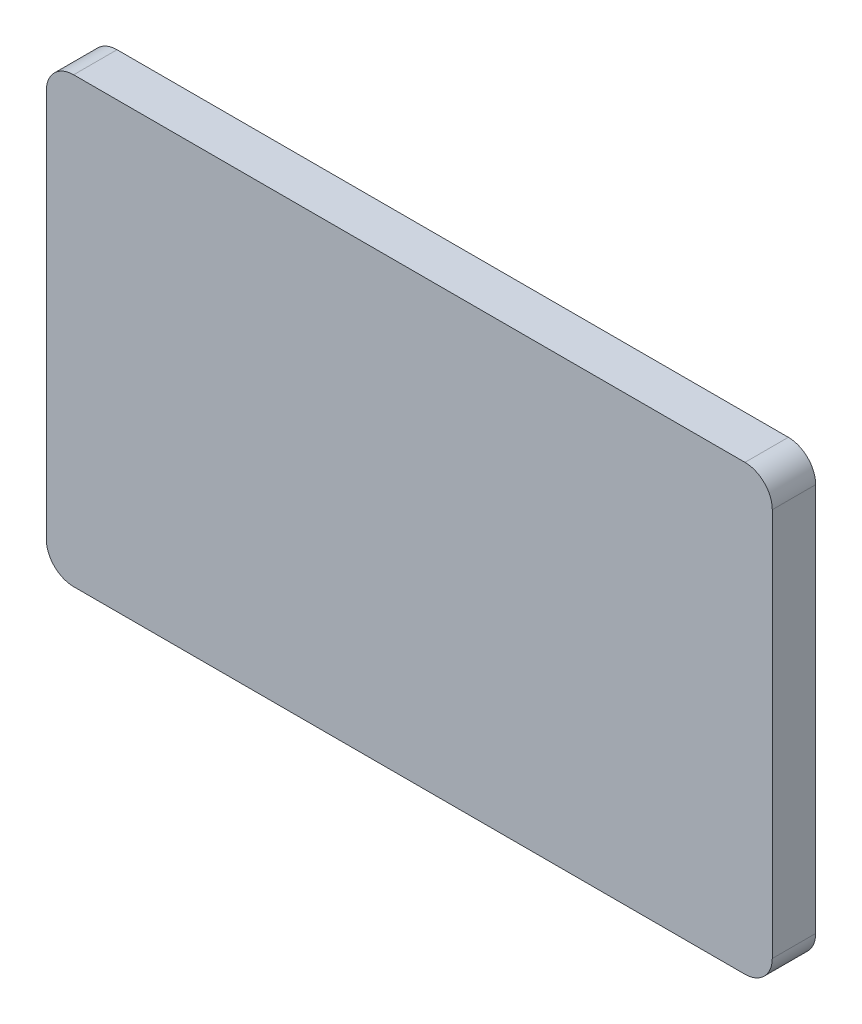
ISO-10303-21;
HEADER;
FILE_DESCRIPTION(('STEP AP214'),'2;1');
FILE_NAME('part.step','',(''),(''),'','','');
FILE_SCHEMA(('AUTOMOTIVE_DESIGN { 1 0 10303 214 1 1 1 1 }'));
ENDSEC;
DATA;
#1=APPLICATION_CONTEXT('core data for automotive mechanical design processes');
#2=APPLICATION_PROTOCOL_DEFINITION('international standard','automotive_design',2000,#1);
#3=PRODUCT_CONTEXT('',#1,'mechanical');
#4=PRODUCT('Part','Part','',(#3));
#5=PRODUCT_RELATED_PRODUCT_CATEGORY('part','',(#4));
#6=PRODUCT_DEFINITION_FORMATION('','',#4);
#7=PRODUCT_DEFINITION_CONTEXT('part definition',#1,'design');
#8=PRODUCT_DEFINITION('design','',#6,#7);
#9=PRODUCT_DEFINITION_SHAPE('','',#8);
#10=(LENGTH_UNIT() NAMED_UNIT(*) SI_UNIT(.MILLI.,.METRE.));
#11=(NAMED_UNIT(*) PLANE_ANGLE_UNIT() SI_UNIT($,.RADIAN.));
#12=(NAMED_UNIT(*) SI_UNIT($,.STERADIAN.) SOLID_ANGLE_UNIT());
#13=UNCERTAINTY_MEASURE_WITH_UNIT(LENGTH_MEASURE(1.E-05),#10,'distance_accuracy_value','');
#14=(GEOMETRIC_REPRESENTATION_CONTEXT(3) GLOBAL_UNCERTAINTY_ASSIGNED_CONTEXT((#13)) GLOBAL_UNIT_ASSIGNED_CONTEXT((#10,
#11,#12)) REPRESENTATION_CONTEXT('',''));
#15=CARTESIAN_POINT('',(0.,0.,0.));
#16=DIRECTION('',(0.,0.,1.));
#17=DIRECTION('',(1.,0.,0.));
#18=AXIS2_PLACEMENT_3D('',#15,#16,#17);
#19=CARTESIAN_POINT('',(-28.1252944361644,50.6768981357298,8.22249975562021));
#20=DIRECTION('',(0.,0.,-1.));
#21=DIRECTION('',(-1.,0.,0.));
#22=AXIS2_PLACEMENT_3D('',#19,#20,#21);
#23=CYLINDRICAL_SURFACE('',#22,1.);
#24=CARTESIAN_POINT('',(-28.1252944361644,50.6768981357298,6.63499975562021));
#25=DIRECTION('',(0.,0.,1.));
#26=DIRECTION('',(1.,0.,0.));
#27=AXIS2_PLACEMENT_3D('',#24,#25,#26);
#28=CIRCLE('',#27,1.);
#29=CARTESIAN_POINT('',(-28.1252944361644,51.6768981357298,6.63499975562021));
#30=VERTEX_POINT('',#29);
#31=CARTESIAN_POINT('',(-29.1252944361645,50.6768981357298,6.63499975562021));
#32=VERTEX_POINT('',#31);
#33=EDGE_CURVE('E256',#30,#32,#28,.T.);
#34=ORIENTED_EDGE('',*,*,#33,.T.);
#35=DIRECTION('',(0.,0.,-1.));
#36=VECTOR('',#35,1.);
#37=CARTESIAN_POINT('',(-29.1252944361645,50.6768981357298,8.22249975562021));
#38=LINE('',#37,#36);
#39=CARTESIAN_POINT('',(-29.1252944361645,50.6768981357298,8.22249975562021));
#40=VERTEX_POINT('',#39);
#41=EDGE_CURVE('E12',#40,#32,#38,.T.);
#42=ORIENTED_EDGE('',*,*,#41,.F.);
#43=CARTESIAN_POINT('',(-28.1252944361644,50.6768981357298,8.22249975562021));
#44=DIRECTION('',(0.,0.,1.));
#45=DIRECTION('',(1.,0.,0.));
#46=AXIS2_PLACEMENT_3D('',#43,#44,#45);
#47=CIRCLE('',#46,1.);
#48=CARTESIAN_POINT('',(-28.1252944361644,51.6768981357298,8.22249975562021));
#49=VERTEX_POINT('',#48);
#50=EDGE_CURVE('E182',#49,#40,#47,.T.);
#51=ORIENTED_EDGE('',*,*,#50,.F.);
#52=DIRECTION('',(0.,0.,-1.));
#53=VECTOR('',#52,1.);
#54=CARTESIAN_POINT('',(-28.1252944361644,51.6768981357298,8.22249975562021));
#55=LINE('',#54,#53);
#56=EDGE_CURVE('E158',#49,#30,#55,.T.);
#57=ORIENTED_EDGE('',*,*,#56,.T.);
#58=EDGE_LOOP('',(#34,#42,#51,#57));
#59=FACE_BOUND('',#58,.T.);
#60=ADVANCED_FACE('F43',(#59),#23,.T.);
#61=CARTESIAN_POINT('',(-29.1252944361645,50.6768981357298,8.22249975562021));
#62=DIRECTION('',(1.,0.,0.));
#63=DIRECTION('',(0.,0.,-1.));
#64=AXIS2_PLACEMENT_3D('',#61,#62,#63);
#65=PLANE('',#64);
#66=DIRECTION('',(0.,-1.,0.));
#67=VECTOR('',#66,1.);
#68=CARTESIAN_POINT('',(-29.1252944361645,50.6768981357298,6.63499975562021));
#69=LINE('',#68,#67);
#70=CARTESIAN_POINT('',(-29.1252944361645,36.4568981357358,6.63499975562021));
#71=VERTEX_POINT('',#70);
#72=EDGE_CURVE('E226',#32,#71,#69,.T.);
#73=ORIENTED_EDGE('',*,*,#72,.T.);
#74=DIRECTION('',(0.,0.,-1.));
#75=VECTOR('',#74,1.);
#76=CARTESIAN_POINT('',(-29.1252944361645,36.4568981357358,8.22249975562021));
#77=LINE('',#76,#75);
#78=CARTESIAN_POINT('',(-29.1252944361645,36.4568981357358,8.22249975562021));
#79=VERTEX_POINT('',#78);
#80=EDGE_CURVE('E54',#79,#71,#77,.T.);
#81=ORIENTED_EDGE('',*,*,#80,.F.);
#82=DIRECTION('',(0.,-1.,0.));
#83=VECTOR('',#82,1.);
#84=CARTESIAN_POINT('',(-29.1252944361645,50.6768981357298,8.22249975562021));
#85=LINE('',#84,#83);
#86=EDGE_CURVE('E117',#40,#79,#85,.T.);
#87=ORIENTED_EDGE('',*,*,#86,.F.);
#88=ORIENTED_EDGE('',*,*,#41,.T.);
#89=EDGE_LOOP('',(#73,#81,#87,#88));
#90=FACE_BOUND('',#89,.T.);
#91=ADVANCED_FACE('F269',(#90),#65,.F.);
#92=CARTESIAN_POINT('',(-28.1252944361644,36.4568981357358,8.22249975562021));
#93=DIRECTION('',(0.,0.,-1.));
#94=DIRECTION('',(-1.,0.,0.));
#95=AXIS2_PLACEMENT_3D('',#92,#93,#94);
#96=CYLINDRICAL_SURFACE('',#95,1.);
#97=CARTESIAN_POINT('',(-28.1252944361644,36.4568981357358,6.63499975562021));
#98=DIRECTION('',(0.,0.,1.));
#99=DIRECTION('',(1.,0.,0.));
#100=AXIS2_PLACEMENT_3D('',#97,#98,#99);
#101=CIRCLE('',#100,1.);
#102=CARTESIAN_POINT('',(-28.1252944361644,35.4568981357358,6.63499975562021));
#103=VERTEX_POINT('',#102);
#104=EDGE_CURVE('E220',#71,#103,#101,.T.);
#105=ORIENTED_EDGE('',*,*,#104,.T.);
#106=DIRECTION('',(0.,0.,-1.));
#107=VECTOR('',#106,1.);
#108=CARTESIAN_POINT('',(-28.1252944361644,35.4568981357358,8.22249975562021));
#109=LINE('',#108,#107);
#110=CARTESIAN_POINT('',(-28.1252944361644,35.4568981357358,8.22249975562021));
#111=VERTEX_POINT('',#110);
#112=EDGE_CURVE('E237',#111,#103,#109,.T.);
#113=ORIENTED_EDGE('',*,*,#112,.F.);
#114=CARTESIAN_POINT('',(-28.1252944361644,36.4568981357358,8.22249975562021));
#115=DIRECTION('',(0.,0.,1.));
#116=DIRECTION('',(1.,0.,0.));
#117=AXIS2_PLACEMENT_3D('',#114,#115,#116);
#118=CIRCLE('',#117,1.);
#119=EDGE_CURVE('E197',#79,#111,#118,.T.);
#120=ORIENTED_EDGE('',*,*,#119,.F.);
#121=ORIENTED_EDGE('',*,*,#80,.T.);
#122=EDGE_LOOP('',(#105,#113,#120,#121));
#123=FACE_BOUND('',#122,.T.);
#124=ADVANCED_FACE('F274',(#123),#96,.T.);
#125=CARTESIAN_POINT('',(-28.1252944361644,35.4568981357358,8.22249975562021));
#126=DIRECTION('',(0.,1.,0.));
#127=DIRECTION('',(0.,0.,1.));
#128=AXIS2_PLACEMENT_3D('',#125,#126,#127);
#129=PLANE('',#128);
#130=DIRECTION('',(1.,0.,0.));
#131=VECTOR('',#130,1.);
#132=CARTESIAN_POINT('',(-28.1252944361644,35.4568981357358,6.63499975562021));
#133=LINE('',#132,#131);
#134=CARTESIAN_POINT('',(-3.56529443617046,35.4568981357358,6.63499975562021));
#135=VERTEX_POINT('',#134);
#136=EDGE_CURVE('E225',#103,#135,#133,.T.);
#137=ORIENTED_EDGE('',*,*,#136,.T.);
#138=DIRECTION('',(0.,0.,-1.));
#139=VECTOR('',#138,1.);
#140=CARTESIAN_POINT('',(-3.56529443617046,35.4568981357358,8.22249975562021));
#141=LINE('',#140,#139);
#142=CARTESIAN_POINT('',(-3.56529443617046,35.4568981357358,8.22249975562021));
#143=VERTEX_POINT('',#142);
#144=EDGE_CURVE('E245',#143,#135,#141,.T.);
#145=ORIENTED_EDGE('',*,*,#144,.F.);
#146=DIRECTION('',(1.,0.,0.));
#147=VECTOR('',#146,1.);
#148=CARTESIAN_POINT('',(-28.1252944361644,35.4568981357358,8.22249975562021));
#149=LINE('',#148,#147);
#150=EDGE_CURVE('E401',#111,#143,#149,.T.);
#151=ORIENTED_EDGE('',*,*,#150,.F.);
#152=ORIENTED_EDGE('',*,*,#112,.T.);
#153=EDGE_LOOP('',(#137,#145,#151,#152));
#154=FACE_BOUND('',#153,.T.);
#155=ADVANCED_FACE('F304',(#154),#129,.F.);
#156=CARTESIAN_POINT('',(-3.56529443617045,36.4568981357358,8.22249975562021));
#157=DIRECTION('',(0.,0.,-1.));
#158=DIRECTION('',(-1.,0.,0.));
#159=AXIS2_PLACEMENT_3D('',#156,#157,#158);
#160=CYLINDRICAL_SURFACE('',#159,1.);
#161=CARTESIAN_POINT('',(-3.56529443617045,36.4568981357358,6.63499975562021));
#162=DIRECTION('',(0.,0.,1.));
#163=DIRECTION('',(1.,0.,0.));
#164=AXIS2_PLACEMENT_3D('',#161,#162,#163);
#165=CIRCLE('',#164,1.);
#166=CARTESIAN_POINT('',(-2.56529443617045,36.4568981357358,6.63499975562021));
#167=VERTEX_POINT('',#166);
#168=EDGE_CURVE('E280',#135,#167,#165,.T.);
#169=ORIENTED_EDGE('',*,*,#168,.T.);
#170=DIRECTION('',(0.,0.,-1.));
#171=VECTOR('',#170,1.);
#172=CARTESIAN_POINT('',(-2.56529443617045,36.4568981357358,8.22249975562021));
#173=LINE('',#172,#171);
#174=CARTESIAN_POINT('',(-2.56529443617045,36.4568981357358,8.22249975562021));
#175=VERTEX_POINT('',#174);
#176=EDGE_CURVE('E151',#175,#167,#173,.T.);
#177=ORIENTED_EDGE('',*,*,#176,.F.);
#178=CARTESIAN_POINT('',(-3.56529443617045,36.4568981357358,8.22249975562021));
#179=DIRECTION('',(0.,0.,1.));
#180=DIRECTION('',(1.,0.,0.));
#181=AXIS2_PLACEMENT_3D('',#178,#179,#180);
#182=CIRCLE('',#181,1.);
#183=EDGE_CURVE('E140',#143,#175,#182,.T.);
#184=ORIENTED_EDGE('',*,*,#183,.F.);
#185=ORIENTED_EDGE('',*,*,#144,.T.);
#186=EDGE_LOOP('',(#169,#177,#184,#185));
#187=FACE_BOUND('',#186,.T.);
#188=ADVANCED_FACE('F314',(#187),#160,.T.);
#189=CARTESIAN_POINT('',(-2.56529443617045,36.4568981357358,8.22249975562021));
#190=DIRECTION('',(-1.,0.,0.));
#191=DIRECTION('',(0.,0.,1.));
#192=AXIS2_PLACEMENT_3D('',#189,#190,#191);
#193=PLANE('',#192);
#194=DIRECTION('',(0.,1.,0.));
#195=VECTOR('',#194,1.);
#196=CARTESIAN_POINT('',(-2.56529443617045,36.4568981357358,6.63499975562021));
#197=LINE('',#196,#195);
#198=CARTESIAN_POINT('',(-2.56529443617045,50.6768981357298,6.63499975562021));
#199=VERTEX_POINT('',#198);
#200=EDGE_CURVE('E149',#167,#199,#197,.T.);
#201=ORIENTED_EDGE('',*,*,#200,.T.);
#202=DIRECTION('',(0.,0.,-1.));
#203=VECTOR('',#202,1.);
#204=CARTESIAN_POINT('',(-2.56529443617045,50.6768981357298,8.22249975562021));
#205=LINE('',#204,#203);
#206=CARTESIAN_POINT('',(-2.56529443617045,50.6768981357298,8.22249975562021));
#207=VERTEX_POINT('',#206);
#208=EDGE_CURVE('E146',#207,#199,#205,.T.);
#209=ORIENTED_EDGE('',*,*,#208,.F.);
#210=DIRECTION('',(0.,1.,0.));
#211=VECTOR('',#210,1.);
#212=CARTESIAN_POINT('',(-2.56529443617045,36.4568981357358,8.22249975562021));
#213=LINE('',#212,#211);
#214=EDGE_CURVE('E134',#175,#207,#213,.T.);
#215=ORIENTED_EDGE('',*,*,#214,.F.);
#216=ORIENTED_EDGE('',*,*,#176,.T.);
#217=EDGE_LOOP('',(#201,#209,#215,#216));
#218=FACE_BOUND('',#217,.T.);
#219=ADVANCED_FACE('F147',(#218),#193,.F.);
#220=CARTESIAN_POINT('',(-3.56529443617045,50.6768981357298,8.22249975562021));
#221=DIRECTION('',(0.,0.,-1.));
#222=DIRECTION('',(-1.,0.,0.));
#223=AXIS2_PLACEMENT_3D('',#220,#221,#222);
#224=CYLINDRICAL_SURFACE('',#223,1.);
#225=CARTESIAN_POINT('',(-3.56529443617045,50.6768981357298,6.63499975562021));
#226=DIRECTION('',(0.,0.,1.));
#227=DIRECTION('',(-1.,0.,0.));
#228=AXIS2_PLACEMENT_3D('',#225,#226,#227);
#229=CIRCLE('',#228,1.);
#230=CARTESIAN_POINT('',(-3.56529443617046,51.6768981357298,6.63499975562021));
#231=VERTEX_POINT('',#230);
#232=EDGE_CURVE('E101',#199,#231,#229,.T.);
#233=ORIENTED_EDGE('',*,*,#232,.T.);
#234=DIRECTION('',(0.,0.,-1.));
#235=VECTOR('',#234,1.);
#236=CARTESIAN_POINT('',(-3.56529443617046,51.6768981357298,8.22249975562021));
#237=LINE('',#236,#235);
#238=CARTESIAN_POINT('',(-3.56529443617046,51.6768981357298,8.22249975562021));
#239=VERTEX_POINT('',#238);
#240=EDGE_CURVE('E152',#239,#231,#237,.T.);
#241=ORIENTED_EDGE('',*,*,#240,.F.);
#242=CARTESIAN_POINT('',(-3.56529443617045,50.6768981357298,8.22249975562021));
#243=DIRECTION('',(0.,0.,1.));
#244=DIRECTION('',(-1.,0.,0.));
#245=AXIS2_PLACEMENT_3D('',#242,#243,#244);
#246=CIRCLE('',#245,1.);
#247=EDGE_CURVE('E138',#207,#239,#246,.T.);
#248=ORIENTED_EDGE('',*,*,#247,.F.);
#249=ORIENTED_EDGE('',*,*,#208,.T.);
#250=EDGE_LOOP('',(#233,#241,#248,#249));
#251=FACE_BOUND('',#250,.T.);
#252=ADVANCED_FACE('F154',(#251),#224,.T.);
#253=CARTESIAN_POINT('',(-3.56529443617046,51.6768981357298,8.22249975562021));
#254=DIRECTION('',(0.,-1.,0.));
#255=DIRECTION('',(0.,0.,-1.));
#256=AXIS2_PLACEMENT_3D('',#253,#254,#255);
#257=PLANE('',#256);
#258=DIRECTION('',(-1.,0.,0.));
#259=VECTOR('',#258,1.);
#260=CARTESIAN_POINT('',(-3.56529443617046,51.6768981357298,6.63499975562021));
#261=LINE('',#260,#259);
#262=EDGE_CURVE('E109',#231,#30,#261,.T.);
#263=ORIENTED_EDGE('',*,*,#262,.T.);
#264=ORIENTED_EDGE('',*,*,#56,.F.);
#265=DIRECTION('',(-1.,0.,0.));
#266=VECTOR('',#265,1.);
#267=CARTESIAN_POINT('',(-3.56529443617046,51.6768981357298,8.22249975562021));
#268=LINE('',#267,#266);
#269=EDGE_CURVE('E65',#239,#49,#268,.T.);
#270=ORIENTED_EDGE('',*,*,#269,.F.);
#271=ORIENTED_EDGE('',*,*,#240,.T.);
#272=EDGE_LOOP('',(#263,#264,#270,#271));
#273=FACE_BOUND('',#272,.T.);
#274=ADVANCED_FACE('F324',(#273),#257,.F.);
#275=CARTESIAN_POINT('',(-28.1252944361644,50.6768981357298,8.22249975562021));
#276=DIRECTION('',(0.,0.,1.));
#277=DIRECTION('',(1.,0.,0.));
#278=AXIS2_PLACEMENT_3D('',#275,#276,#277);
#279=PLANE('',#278);
#280=ORIENTED_EDGE('',*,*,#50,.T.);
#281=ORIENTED_EDGE('',*,*,#86,.T.);
#282=ORIENTED_EDGE('',*,*,#119,.T.);
#283=ORIENTED_EDGE('',*,*,#150,.T.);
#284=ORIENTED_EDGE('',*,*,#183,.T.);
#285=ORIENTED_EDGE('',*,*,#214,.T.);
#286=ORIENTED_EDGE('',*,*,#247,.T.);
#287=ORIENTED_EDGE('',*,*,#269,.T.);
#288=EDGE_LOOP('',(#280,#281,#282,#283,#284,#285,#286,#287));
#289=FACE_BOUND('',#288,.T.);
#290=ADVANCED_FACE('F136',(#289),#279,.T.);
#291=CARTESIAN_POINT('',(-28.1252944361644,50.6768981357298,6.63499975562021));
#292=DIRECTION('',(0.,0.,1.));
#293=DIRECTION('',(1.,0.,0.));
#294=AXIS2_PLACEMENT_3D('',#291,#292,#293);
#295=PLANE('',#294);
#296=ORIENTED_EDGE('',*,*,#33,.F.);
#297=ORIENTED_EDGE('',*,*,#262,.F.);
#298=ORIENTED_EDGE('',*,*,#232,.F.);
#299=ORIENTED_EDGE('',*,*,#200,.F.);
#300=ORIENTED_EDGE('',*,*,#168,.F.);
#301=ORIENTED_EDGE('',*,*,#136,.F.);
#302=ORIENTED_EDGE('',*,*,#104,.F.);
#303=ORIENTED_EDGE('',*,*,#72,.F.);
#304=EDGE_LOOP('',(#296,#297,#298,#299,#300,#301,#302,#303));
#305=FACE_BOUND('',#304,.T.);
#306=ADVANCED_FACE('F278',(#305),#295,.F.);
#307=CLOSED_SHELL('',(#60,#91,#124,#155,#188,#219,#252,#274,#290,#306));
#308=MANIFOLD_SOLID_BREP('B2',#307);
#309=ADVANCED_BREP_SHAPE_REPRESENTATION('',(#18,#308),#14);
#310=SHAPE_DEFINITION_REPRESENTATION(#9,#309);
ENDSEC;
END-ISO-10303-21;
